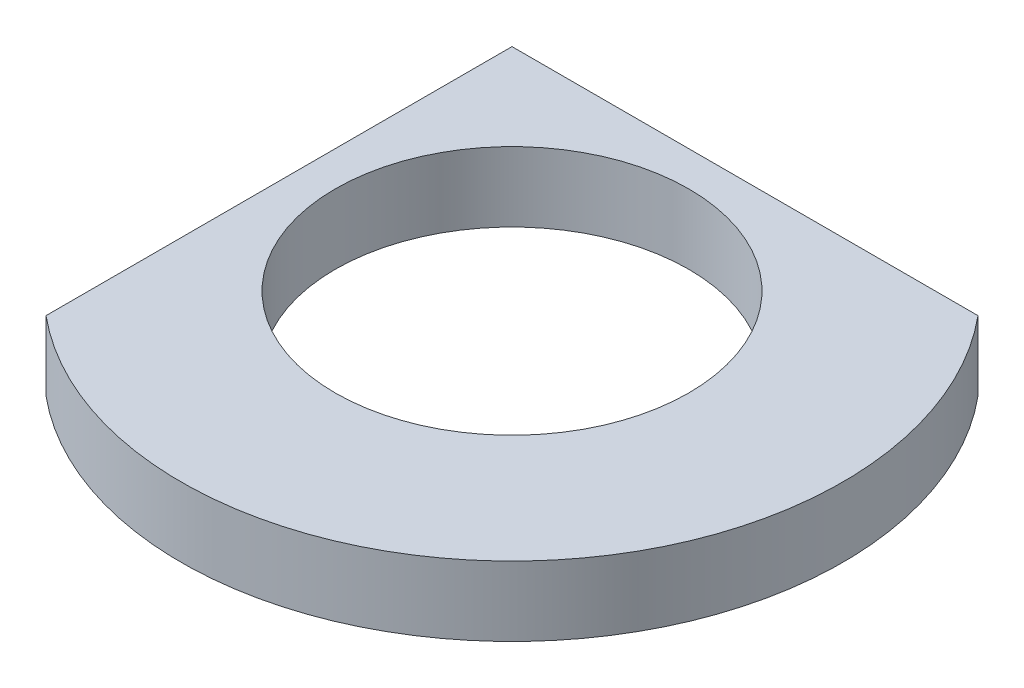
ISO-10303-21;
HEADER;
FILE_DESCRIPTION(('STEP AP214'),'2;1');
FILE_NAME('part.step','',(''),(''),'','','');
FILE_SCHEMA(('AUTOMOTIVE_DESIGN { 1 0 10303 214 1 1 1 1 }'));
ENDSEC;
DATA;
#1=APPLICATION_CONTEXT('core data for automotive mechanical design processes');
#2=APPLICATION_PROTOCOL_DEFINITION('international standard','automotive_design',2000,#1);
#3=PRODUCT_CONTEXT('',#1,'mechanical');
#4=PRODUCT('Part','Part','',(#3));
#5=PRODUCT_RELATED_PRODUCT_CATEGORY('part','',(#4));
#6=PRODUCT_DEFINITION_FORMATION('','',#4);
#7=PRODUCT_DEFINITION_CONTEXT('part definition',#1,'design');
#8=PRODUCT_DEFINITION('design','',#6,#7);
#9=PRODUCT_DEFINITION_SHAPE('','',#8);
#10=(LENGTH_UNIT() NAMED_UNIT(*) SI_UNIT(.MILLI.,.METRE.));
#11=(NAMED_UNIT(*) PLANE_ANGLE_UNIT() SI_UNIT($,.RADIAN.));
#12=(NAMED_UNIT(*) SI_UNIT($,.STERADIAN.) SOLID_ANGLE_UNIT());
#13=UNCERTAINTY_MEASURE_WITH_UNIT(LENGTH_MEASURE(1.E-05),#10,'distance_accuracy_value','');
#14=(GEOMETRIC_REPRESENTATION_CONTEXT(3) GLOBAL_UNCERTAINTY_ASSIGNED_CONTEXT((#13)) GLOBAL_UNIT_ASSIGNED_CONTEXT((#10,
#11,#12)) REPRESENTATION_CONTEXT('',''));
#15=CARTESIAN_POINT('',(0.,0.,0.));
#16=DIRECTION('',(0.,0.,1.));
#17=DIRECTION('',(1.,0.,0.));
#18=AXIS2_PLACEMENT_3D('',#15,#16,#17);
#19=CARTESIAN_POINT('',(0.,4.,0.));
#20=DIRECTION('',(0.,1.,0.));
#21=DIRECTION('',(0.,0.,1.));
#22=AXIS2_PLACEMENT_3D('',#19,#20,#21);
#23=PLANE('',#22);
#24=DIRECTION('',(0.,0.,-1.));
#25=VECTOR('',#24,1.);
#26=CARTESIAN_POINT('',(-12.15,4.,-12.15));
#27=LINE('',#26,#25);
#28=CARTESIAN_POINT('',(-12.15,4.,14.6074467310341));
#29=VERTEX_POINT('',#28);
#30=CARTESIAN_POINT('',(-12.15,4.,-12.15));
#31=VERTEX_POINT('',#30);
#32=EDGE_CURVE('E50',#29,#31,#27,.T.);
#33=ORIENTED_EDGE('',*,*,#32,.F.);
#34=CARTESIAN_POINT('',(0.,4.,0.));
#35=DIRECTION('',(0.,1.,0.));
#36=DIRECTION('',(0.,0.,1.));
#37=AXIS2_PLACEMENT_3D('',#34,#35,#36);
#38=CIRCLE('',#37,19.);
#39=CARTESIAN_POINT('',(14.6074467310341,4.,-12.15));
#40=VERTEX_POINT('',#39);
#41=EDGE_CURVE('E43',#29,#40,#38,.T.);
#42=ORIENTED_EDGE('',*,*,#41,.T.);
#43=DIRECTION('',(1.,0.,0.));
#44=VECTOR('',#43,1.);
#45=CARTESIAN_POINT('',(-19.,4.,-12.15));
#46=LINE('',#45,#44);
#47=EDGE_CURVE('E87',#31,#40,#46,.T.);
#48=ORIENTED_EDGE('',*,*,#47,.F.);
#49=EDGE_LOOP('',(#33,#42,#48));
#50=FACE_BOUND('',#49,.T.);
#51=CARTESIAN_POINT('',(0.,4.,0.));
#52=DIRECTION('',(0.,1.,0.));
#53=DIRECTION('',(0.,0.,1.));
#54=AXIS2_PLACEMENT_3D('',#51,#52,#53);
#55=CIRCLE('',#54,10.15);
#56=CARTESIAN_POINT('',(0.,4.,10.15));
#57=VERTEX_POINT('',#56);
#58=EDGE_CURVE('E90',#57,#57,#55,.T.);
#59=ORIENTED_EDGE('',*,*,#58,.F.);
#60=EDGE_LOOP('',(#59));
#61=FACE_BOUND('',#60,.T.);
#62=ADVANCED_FACE('F35',(#50,#61),#23,.T.);
#63=CARTESIAN_POINT('',(0.,0.,0.));
#64=DIRECTION('',(0.,1.,0.));
#65=DIRECTION('',(0.,0.,1.));
#66=AXIS2_PLACEMENT_3D('',#63,#64,#65);
#67=PLANE('',#66);
#68=CARTESIAN_POINT('',(0.,0.,0.));
#69=DIRECTION('',(0.,1.,0.));
#70=DIRECTION('',(0.,0.,1.));
#71=AXIS2_PLACEMENT_3D('',#68,#69,#70);
#72=CIRCLE('',#71,19.);
#73=CARTESIAN_POINT('',(-12.15,0.,14.6074467310341));
#74=VERTEX_POINT('',#73);
#75=CARTESIAN_POINT('',(14.6074467310341,0.,-12.15));
#76=VERTEX_POINT('',#75);
#77=EDGE_CURVE('E83',#74,#76,#72,.T.);
#78=ORIENTED_EDGE('',*,*,#77,.F.);
#79=DIRECTION('',(0.,0.,-1.));
#80=VECTOR('',#79,1.);
#81=CARTESIAN_POINT('',(-12.15,0.,-12.15));
#82=LINE('',#81,#80);
#83=CARTESIAN_POINT('',(-12.15,0.,-12.15));
#84=VERTEX_POINT('',#83);
#85=EDGE_CURVE('E70',#74,#84,#82,.T.);
#86=ORIENTED_EDGE('',*,*,#85,.T.);
#87=DIRECTION('',(1.,0.,0.));
#88=VECTOR('',#87,1.);
#89=CARTESIAN_POINT('',(-19.,0.,-12.15));
#90=LINE('',#89,#88);
#91=EDGE_CURVE('E81',#84,#76,#90,.T.);
#92=ORIENTED_EDGE('',*,*,#91,.T.);
#93=EDGE_LOOP('',(#78,#86,#92));
#94=FACE_BOUND('',#93,.T.);
#95=CARTESIAN_POINT('',(0.,0.,0.));
#96=DIRECTION('',(0.,1.,0.));
#97=DIRECTION('',(0.,0.,1.));
#98=AXIS2_PLACEMENT_3D('',#95,#96,#97);
#99=CIRCLE('',#98,10.15);
#100=CARTESIAN_POINT('',(0.,0.,10.15));
#101=VERTEX_POINT('',#100);
#102=EDGE_CURVE('E86',#101,#101,#99,.T.);
#103=ORIENTED_EDGE('',*,*,#102,.T.);
#104=EDGE_LOOP('',(#103));
#105=FACE_BOUND('',#104,.T.);
#106=ADVANCED_FACE('F79',(#94,#105),#67,.F.);
#107=CARTESIAN_POINT('',(0.,4.,0.));
#108=DIRECTION('',(0.,-1.,0.));
#109=DIRECTION('',(0.,0.,-1.));
#110=AXIS2_PLACEMENT_3D('',#107,#108,#109);
#111=CYLINDRICAL_SURFACE('',#110,19.);
#112=ORIENTED_EDGE('',*,*,#41,.F.);
#113=DIRECTION('',(0.,-1.,0.));
#114=VECTOR('',#113,1.);
#115=CARTESIAN_POINT('',(-12.15,4.,14.6074467310341));
#116=LINE('',#115,#114);
#117=EDGE_CURVE('E74',#29,#74,#116,.T.);
#118=ORIENTED_EDGE('',*,*,#117,.T.);
#119=ORIENTED_EDGE('',*,*,#77,.T.);
#120=DIRECTION('',(0.,-1.,0.));
#121=VECTOR('',#120,1.);
#122=CARTESIAN_POINT('',(14.6074467310341,4.,-12.15));
#123=LINE('',#122,#121);
#124=EDGE_CURVE('E11',#76,#40,#123,.F.);
#125=ORIENTED_EDGE('',*,*,#124,.T.);
#126=EDGE_LOOP('',(#112,#118,#119,#125));
#127=FACE_BOUND('',#126,.T.);
#128=ADVANCED_FACE('F37',(#127),#111,.T.);
#129=CARTESIAN_POINT('',(0.,4.,0.));
#130=DIRECTION('',(0.,-1.,0.));
#131=DIRECTION('',(0.,0.,-1.));
#132=AXIS2_PLACEMENT_3D('',#129,#130,#131);
#133=CYLINDRICAL_SURFACE('',#132,10.15);
#134=ORIENTED_EDGE('',*,*,#58,.T.);
#135=EDGE_LOOP('',(#134));
#136=FACE_BOUND('',#135,.T.);
#137=ORIENTED_EDGE('',*,*,#102,.F.);
#138=EDGE_LOOP('',(#137));
#139=FACE_BOUND('',#138,.T.);
#140=ADVANCED_FACE('F104',(#136,#139),#133,.F.);
#141=CARTESIAN_POINT('',(-19.,0.,-12.15));
#142=DIRECTION('',(0.,0.,1.));
#143=DIRECTION('',(1.,0.,0.));
#144=AXIS2_PLACEMENT_3D('',#141,#142,#143);
#145=PLANE('',#144);
#146=ORIENTED_EDGE('',*,*,#91,.F.);
#147=DIRECTION('',(0.,1.,0.));
#148=VECTOR('',#147,1.);
#149=CARTESIAN_POINT('',(-12.15,0.,-12.15));
#150=LINE('',#149,#148);
#151=EDGE_CURVE('E67',#84,#31,#150,.T.);
#152=ORIENTED_EDGE('',*,*,#151,.T.);
#153=ORIENTED_EDGE('',*,*,#47,.T.);
#154=ORIENTED_EDGE('',*,*,#124,.F.);
#155=EDGE_LOOP('',(#146,#152,#153,#154));
#156=FACE_BOUND('',#155,.T.);
#157=ADVANCED_FACE('F85',(#156),#145,.F.);
#158=CARTESIAN_POINT('',(-12.15,0.,-12.15));
#159=DIRECTION('',(1.,0.,0.));
#160=DIRECTION('',(0.,0.,-1.));
#161=AXIS2_PLACEMENT_3D('',#158,#159,#160);
#162=PLANE('',#161);
#163=ORIENTED_EDGE('',*,*,#32,.T.);
#164=ORIENTED_EDGE('',*,*,#151,.F.);
#165=ORIENTED_EDGE('',*,*,#85,.F.);
#166=ORIENTED_EDGE('',*,*,#117,.F.);
#167=EDGE_LOOP('',(#163,#164,#165,#166));
#168=FACE_BOUND('',#167,.T.);
#169=ADVANCED_FACE('F69',(#168),#162,.F.);
#170=CLOSED_SHELL('',(#62,#106,#128,#140,#157,#169));
#171=MANIFOLD_SOLID_BREP('B2',#170);
#172=ADVANCED_BREP_SHAPE_REPRESENTATION('',(#18,#171),#14);
#173=SHAPE_DEFINITION_REPRESENTATION(#9,#172);
ENDSEC;
END-ISO-10303-21;
